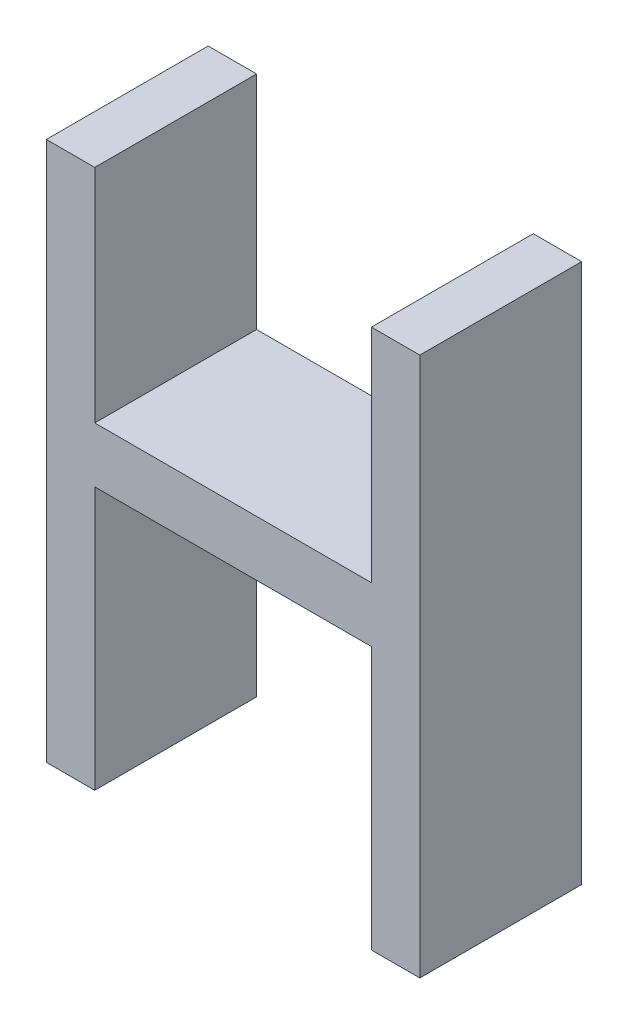
ISO-10303-21;
HEADER;
FILE_DESCRIPTION(('STEP AP214'),'2;1');
FILE_NAME('part.step','',(''),(''),'','','');
FILE_SCHEMA(('AUTOMOTIVE_DESIGN { 1 0 10303 214 1 1 1 1 }'));
ENDSEC;
DATA;
#1=APPLICATION_CONTEXT('core data for automotive mechanical design processes');
#2=APPLICATION_PROTOCOL_DEFINITION('international standard','automotive_design',2000,#1);
#3=PRODUCT_CONTEXT('',#1,'mechanical');
#4=PRODUCT('Part','Part','',(#3));
#5=PRODUCT_RELATED_PRODUCT_CATEGORY('part','',(#4));
#6=PRODUCT_DEFINITION_FORMATION('','',#4);
#7=PRODUCT_DEFINITION_CONTEXT('part definition',#1,'design');
#8=PRODUCT_DEFINITION('design','',#6,#7);
#9=PRODUCT_DEFINITION_SHAPE('','',#8);
#10=(LENGTH_UNIT() NAMED_UNIT(*) SI_UNIT(.MILLI.,.METRE.));
#11=(NAMED_UNIT(*) PLANE_ANGLE_UNIT() SI_UNIT($,.RADIAN.));
#12=(NAMED_UNIT(*) SI_UNIT($,.STERADIAN.) SOLID_ANGLE_UNIT());
#13=UNCERTAINTY_MEASURE_WITH_UNIT(LENGTH_MEASURE(1.E-05),#10,'distance_accuracy_value','');
#14=(GEOMETRIC_REPRESENTATION_CONTEXT(3) GLOBAL_UNCERTAINTY_ASSIGNED_CONTEXT((#13)) GLOBAL_UNIT_ASSIGNED_CONTEXT((#10,
#11,#12)) REPRESENTATION_CONTEXT('',''));
#15=CARTESIAN_POINT('',(0.,0.,0.));
#16=DIRECTION('',(0.,0.,1.));
#17=DIRECTION('',(1.,0.,0.));
#18=AXIS2_PLACEMENT_3D('',#15,#16,#17);
#19=CARTESIAN_POINT('',(-55.4324653258695,-22.8701190762308,1.5));
#20=DIRECTION('',(-1.,0.,0.));
#21=DIRECTION('',(0.,0.,1.));
#22=AXIS2_PLACEMENT_3D('',#19,#20,#21);
#23=PLANE('',#22);
#24=DIRECTION('',(0.,1.,0.));
#25=VECTOR('',#24,1.);
#26=CARTESIAN_POINT('',(-55.4324653258695,-22.8701190762308,0.));
#27=LINE('',#26,#25);
#28=CARTESIAN_POINT('',(-55.4324653258695,-22.8701190762308,0.));
#29=VERTEX_POINT('',#28);
#30=CARTESIAN_POINT('',(-55.4324653258695,-17.8701190762308,0.));
#31=VERTEX_POINT('',#30);
#32=EDGE_CURVE('E154',#29,#31,#27,.T.);
#33=ORIENTED_EDGE('',*,*,#32,.F.);
#34=DIRECTION('',(0.,0.,-1.));
#35=VECTOR('',#34,1.);
#36=CARTESIAN_POINT('',(-55.4324653258695,-22.8701190762308,1.5));
#37=LINE('',#36,#35);
#38=CARTESIAN_POINT('',(-55.4324653258695,-22.8701190762308,1.5));
#39=VERTEX_POINT('',#38);
#40=EDGE_CURVE('E11',#39,#29,#37,.T.);
#41=ORIENTED_EDGE('',*,*,#40,.F.);
#42=DIRECTION('',(0.,1.,0.));
#43=VECTOR('',#42,1.);
#44=CARTESIAN_POINT('',(-55.4324653258695,-22.8701190762308,1.5));
#45=LINE('',#44,#43);
#46=CARTESIAN_POINT('',(-55.4324653258695,-17.8701190762308,1.5));
#47=VERTEX_POINT('',#46);
#48=EDGE_CURVE('E186',#39,#47,#45,.T.);
#49=ORIENTED_EDGE('',*,*,#48,.T.);
#50=DIRECTION('',(0.,0.,-1.));
#51=VECTOR('',#50,1.);
#52=CARTESIAN_POINT('',(-55.4324653258695,-17.8701190762308,1.5));
#53=LINE('',#52,#51);
#54=EDGE_CURVE('E36',#47,#31,#53,.T.);
#55=ORIENTED_EDGE('',*,*,#54,.T.);
#56=EDGE_LOOP('',(#33,#41,#49,#55));
#57=FACE_BOUND('',#56,.T.);
#58=ADVANCED_FACE('F33',(#57),#23,.T.);
#59=CARTESIAN_POINT('',(-54.9837473771516,-22.8701190762308,1.5));
#60=DIRECTION('',(0.,-1.,0.));
#61=DIRECTION('',(0.,0.,-1.));
#62=AXIS2_PLACEMENT_3D('',#59,#60,#61);
#63=PLANE('',#62);
#64=DIRECTION('',(-1.,0.,0.));
#65=VECTOR('',#64,1.);
#66=CARTESIAN_POINT('',(-54.9837473771516,-22.8701190762308,0.));
#67=LINE('',#66,#65);
#68=CARTESIAN_POINT('',(-54.9837473771516,-22.8701190762308,0.));
#69=VERTEX_POINT('',#68);
#70=EDGE_CURVE('E184',#69,#29,#67,.T.);
#71=ORIENTED_EDGE('',*,*,#70,.F.);
#72=DIRECTION('',(0.,0.,-1.));
#73=VECTOR('',#72,1.);
#74=CARTESIAN_POINT('',(-54.9837473771516,-22.8701190762308,1.5));
#75=LINE('',#74,#73);
#76=CARTESIAN_POINT('',(-54.9837473771516,-22.8701190762308,1.5));
#77=VERTEX_POINT('',#76);
#78=EDGE_CURVE('E42',#77,#69,#75,.T.);
#79=ORIENTED_EDGE('',*,*,#78,.F.);
#80=DIRECTION('',(-1.,0.,0.));
#81=VECTOR('',#80,1.);
#82=CARTESIAN_POINT('',(-54.9837473771516,-22.8701190762308,1.5));
#83=LINE('',#82,#81);
#84=EDGE_CURVE('E144',#77,#39,#83,.T.);
#85=ORIENTED_EDGE('',*,*,#84,.T.);
#86=ORIENTED_EDGE('',*,*,#40,.T.);
#87=EDGE_LOOP('',(#71,#79,#85,#86));
#88=FACE_BOUND('',#87,.T.);
#89=ADVANCED_FACE('F206',(#88),#63,.T.);
#90=CARTESIAN_POINT('',(-54.9837473771516,-20.4342216403334,1.5));
#91=DIRECTION('',(1.,0.,0.));
#92=DIRECTION('',(0.,0.,-1.));
#93=AXIS2_PLACEMENT_3D('',#90,#91,#92);
#94=PLANE('',#93);
#95=DIRECTION('',(0.,-1.,0.));
#96=VECTOR('',#95,1.);
#97=CARTESIAN_POINT('',(-54.9837473771516,-20.4342216403334,0.));
#98=LINE('',#97,#96);
#99=CARTESIAN_POINT('',(-54.9837473771516,-20.4342216403334,0.));
#100=VERTEX_POINT('',#99);
#101=EDGE_CURVE('E131',#100,#69,#98,.T.);
#102=ORIENTED_EDGE('',*,*,#101,.F.);
#103=DIRECTION('',(0.,0.,-1.));
#104=VECTOR('',#103,1.);
#105=CARTESIAN_POINT('',(-54.9837473771516,-20.4342216403334,1.5));
#106=LINE('',#105,#104);
#107=CARTESIAN_POINT('',(-54.9837473771516,-20.4342216403334,1.5));
#108=VERTEX_POINT('',#107);
#109=EDGE_CURVE('E126',#108,#100,#106,.T.);
#110=ORIENTED_EDGE('',*,*,#109,.F.);
#111=DIRECTION('',(0.,-1.,0.));
#112=VECTOR('',#111,1.);
#113=CARTESIAN_POINT('',(-54.9837473771516,-20.4342216403334,1.5));
#114=LINE('',#113,#112);
#115=EDGE_CURVE('E129',#108,#77,#114,.T.);
#116=ORIENTED_EDGE('',*,*,#115,.T.);
#117=ORIENTED_EDGE('',*,*,#78,.T.);
#118=EDGE_LOOP('',(#102,#110,#116,#117));
#119=FACE_BOUND('',#118,.T.);
#120=ADVANCED_FACE('F128',(#119),#94,.T.);
#121=CARTESIAN_POINT('',(-52.419644813049,-20.4342216403334,1.5));
#122=DIRECTION('',(0.,-1.,0.));
#123=DIRECTION('',(0.,0.,-1.));
#124=AXIS2_PLACEMENT_3D('',#121,#122,#123);
#125=PLANE('',#124);
#126=DIRECTION('',(-1.,0.,0.));
#127=VECTOR('',#126,1.);
#128=CARTESIAN_POINT('',(-52.419644813049,-20.4342216403334,0.));
#129=LINE('',#128,#127);
#130=CARTESIAN_POINT('',(-52.419644813049,-20.4342216403334,0.));
#131=VERTEX_POINT('',#130);
#132=EDGE_CURVE('E181',#131,#100,#129,.T.);
#133=ORIENTED_EDGE('',*,*,#132,.F.);
#134=DIRECTION('',(0.,0.,-1.));
#135=VECTOR('',#134,1.);
#136=CARTESIAN_POINT('',(-52.419644813049,-20.4342216403334,1.5));
#137=LINE('',#136,#135);
#138=CARTESIAN_POINT('',(-52.419644813049,-20.4342216403334,1.5));
#139=VERTEX_POINT('',#138);
#140=EDGE_CURVE('E136',#139,#131,#137,.T.);
#141=ORIENTED_EDGE('',*,*,#140,.F.);
#142=DIRECTION('',(-1.,0.,0.));
#143=VECTOR('',#142,1.);
#144=CARTESIAN_POINT('',(-52.419644813049,-20.4342216403334,1.5));
#145=LINE('',#144,#143);
#146=EDGE_CURVE('E142',#139,#108,#145,.T.);
#147=ORIENTED_EDGE('',*,*,#146,.T.);
#148=ORIENTED_EDGE('',*,*,#109,.T.);
#149=EDGE_LOOP('',(#133,#141,#147,#148));
#150=FACE_BOUND('',#149,.T.);
#151=ADVANCED_FACE('F146',(#150),#125,.T.);
#152=CARTESIAN_POINT('',(-52.419644813049,-22.8701190762308,1.5));
#153=DIRECTION('',(-1.,0.,0.));
#154=DIRECTION('',(0.,0.,1.));
#155=AXIS2_PLACEMENT_3D('',#152,#153,#154);
#156=PLANE('',#155);
#157=DIRECTION('',(0.,1.,0.));
#158=VECTOR('',#157,1.);
#159=CARTESIAN_POINT('',(-52.419644813049,-22.8701190762308,0.));
#160=LINE('',#159,#158);
#161=CARTESIAN_POINT('',(-52.419644813049,-22.8701190762308,0.));
#162=VERTEX_POINT('',#161);
#163=EDGE_CURVE('E178',#162,#131,#160,.T.);
#164=ORIENTED_EDGE('',*,*,#163,.F.);
#165=DIRECTION('',(0.,0.,-1.));
#166=VECTOR('',#165,1.);
#167=CARTESIAN_POINT('',(-52.419644813049,-22.8701190762308,1.5));
#168=LINE('',#167,#166);
#169=CARTESIAN_POINT('',(-52.419644813049,-22.8701190762308,1.5));
#170=VERTEX_POINT('',#169);
#171=EDGE_CURVE('E190',#170,#162,#168,.T.);
#172=ORIENTED_EDGE('',*,*,#171,.F.);
#173=DIRECTION('',(0.,1.,0.));
#174=VECTOR('',#173,1.);
#175=CARTESIAN_POINT('',(-52.419644813049,-22.8701190762308,1.5));
#176=LINE('',#175,#174);
#177=EDGE_CURVE('E147',#170,#139,#176,.T.);
#178=ORIENTED_EDGE('',*,*,#177,.T.);
#179=ORIENTED_EDGE('',*,*,#140,.T.);
#180=EDGE_LOOP('',(#164,#172,#178,#179));
#181=FACE_BOUND('',#180,.T.);
#182=ADVANCED_FACE('F219',(#181),#156,.T.);
#183=CARTESIAN_POINT('',(-51.9709268643311,-22.8701190762308,1.5));
#184=DIRECTION('',(0.,-1.,0.));
#185=DIRECTION('',(0.,0.,-1.));
#186=AXIS2_PLACEMENT_3D('',#183,#184,#185);
#187=PLANE('',#186);
#188=DIRECTION('',(-1.,0.,0.));
#189=VECTOR('',#188,1.);
#190=CARTESIAN_POINT('',(-51.9709268643311,-22.8701190762308,0.));
#191=LINE('',#190,#189);
#192=CARTESIAN_POINT('',(-51.9709268643311,-22.8701190762308,0.));
#193=VERTEX_POINT('',#192);
#194=EDGE_CURVE('E175',#193,#162,#191,.T.);
#195=ORIENTED_EDGE('',*,*,#194,.F.);
#196=DIRECTION('',(0.,0.,-1.));
#197=VECTOR('',#196,1.);
#198=CARTESIAN_POINT('',(-51.9709268643311,-22.8701190762308,1.5));
#199=LINE('',#198,#197);
#200=CARTESIAN_POINT('',(-51.9709268643311,-22.8701190762308,1.5));
#201=VERTEX_POINT('',#200);
#202=EDGE_CURVE('E192',#201,#193,#199,.T.);
#203=ORIENTED_EDGE('',*,*,#202,.F.);
#204=DIRECTION('',(-1.,0.,0.));
#205=VECTOR('',#204,1.);
#206=CARTESIAN_POINT('',(-51.9709268643311,-22.8701190762308,1.5));
#207=LINE('',#206,#205);
#208=EDGE_CURVE('E149',#201,#170,#207,.T.);
#209=ORIENTED_EDGE('',*,*,#208,.T.);
#210=ORIENTED_EDGE('',*,*,#171,.T.);
#211=EDGE_LOOP('',(#195,#203,#209,#210));
#212=FACE_BOUND('',#211,.T.);
#213=ADVANCED_FACE('F222',(#212),#187,.T.);
#214=CARTESIAN_POINT('',(-51.9709268643311,-17.8701190762308,1.5));
#215=DIRECTION('',(1.,0.,0.));
#216=DIRECTION('',(0.,0.,-1.));
#217=AXIS2_PLACEMENT_3D('',#214,#215,#216);
#218=PLANE('',#217);
#219=DIRECTION('',(0.,-1.,0.));
#220=VECTOR('',#219,1.);
#221=CARTESIAN_POINT('',(-51.9709268643311,-17.8701190762308,0.));
#222=LINE('',#221,#220);
#223=CARTESIAN_POINT('',(-51.9709268643311,-17.8701190762308,0.));
#224=VERTEX_POINT('',#223);
#225=EDGE_CURVE('E172',#224,#193,#222,.T.);
#226=ORIENTED_EDGE('',*,*,#225,.F.);
#227=DIRECTION('',(0.,0.,-1.));
#228=VECTOR('',#227,1.);
#229=CARTESIAN_POINT('',(-51.9709268643311,-17.8701190762308,1.5));
#230=LINE('',#229,#228);
#231=CARTESIAN_POINT('',(-51.9709268643311,-17.8701190762308,1.5));
#232=VERTEX_POINT('',#231);
#233=EDGE_CURVE('E194',#232,#224,#230,.T.);
#234=ORIENTED_EDGE('',*,*,#233,.F.);
#235=DIRECTION('',(0.,-1.,0.));
#236=VECTOR('',#235,1.);
#237=CARTESIAN_POINT('',(-51.9709268643311,-17.8701190762308,1.5));
#238=LINE('',#237,#236);
#239=EDGE_CURVE('E366',#232,#201,#238,.T.);
#240=ORIENTED_EDGE('',*,*,#239,.T.);
#241=ORIENTED_EDGE('',*,*,#202,.T.);
#242=EDGE_LOOP('',(#226,#234,#240,#241));
#243=FACE_BOUND('',#242,.T.);
#244=ADVANCED_FACE('F226',(#243),#218,.T.);
#245=CARTESIAN_POINT('',(-52.419644813049,-17.8701190762308,1.5));
#246=DIRECTION('',(0.,1.,0.));
#247=DIRECTION('',(0.,0.,1.));
#248=AXIS2_PLACEMENT_3D('',#245,#246,#247);
#249=PLANE('',#248);
#250=DIRECTION('',(1.,0.,0.));
#251=VECTOR('',#250,1.);
#252=CARTESIAN_POINT('',(-52.419644813049,-17.8701190762308,0.));
#253=LINE('',#252,#251);
#254=CARTESIAN_POINT('',(-52.419644813049,-17.8701190762308,0.));
#255=VERTEX_POINT('',#254);
#256=EDGE_CURVE('E169',#255,#224,#253,.T.);
#257=ORIENTED_EDGE('',*,*,#256,.F.);
#258=DIRECTION('',(0.,0.,-1.));
#259=VECTOR('',#258,1.);
#260=CARTESIAN_POINT('',(-52.419644813049,-17.8701190762308,1.5));
#261=LINE('',#260,#259);
#262=CARTESIAN_POINT('',(-52.419644813049,-17.8701190762308,1.5));
#263=VERTEX_POINT('',#262);
#264=EDGE_CURVE('E196',#263,#255,#261,.T.);
#265=ORIENTED_EDGE('',*,*,#264,.F.);
#266=DIRECTION('',(1.,0.,0.));
#267=VECTOR('',#266,1.);
#268=CARTESIAN_POINT('',(-52.419644813049,-17.8701190762308,1.5));
#269=LINE('',#268,#267);
#270=EDGE_CURVE('E370',#263,#232,#269,.T.);
#271=ORIENTED_EDGE('',*,*,#270,.T.);
#272=ORIENTED_EDGE('',*,*,#233,.T.);
#273=EDGE_LOOP('',(#257,#265,#271,#272));
#274=FACE_BOUND('',#273,.T.);
#275=ADVANCED_FACE('F230',(#274),#249,.T.);
#276=CARTESIAN_POINT('',(-52.419644813049,-19.9214011275129,1.5));
#277=DIRECTION('',(-1.,0.,0.));
#278=DIRECTION('',(0.,0.,1.));
#279=AXIS2_PLACEMENT_3D('',#276,#277,#278);
#280=PLANE('',#279);
#281=DIRECTION('',(0.,1.,0.));
#282=VECTOR('',#281,1.);
#283=CARTESIAN_POINT('',(-52.419644813049,-19.9214011275129,0.));
#284=LINE('',#283,#282);
#285=CARTESIAN_POINT('',(-52.419644813049,-19.9214011275129,0.));
#286=VERTEX_POINT('',#285);
#287=EDGE_CURVE('E166',#286,#255,#284,.T.);
#288=ORIENTED_EDGE('',*,*,#287,.F.);
#289=DIRECTION('',(0.,0.,-1.));
#290=VECTOR('',#289,1.);
#291=CARTESIAN_POINT('',(-52.419644813049,-19.9214011275129,1.5));
#292=LINE('',#291,#290);
#293=CARTESIAN_POINT('',(-52.419644813049,-19.9214011275129,1.5));
#294=VERTEX_POINT('',#293);
#295=EDGE_CURVE('E198',#294,#286,#292,.T.);
#296=ORIENTED_EDGE('',*,*,#295,.F.);
#297=DIRECTION('',(0.,1.,0.));
#298=VECTOR('',#297,1.);
#299=CARTESIAN_POINT('',(-52.419644813049,-19.9214011275129,1.5));
#300=LINE('',#299,#298);
#301=EDGE_CURVE('E359',#294,#263,#300,.T.);
#302=ORIENTED_EDGE('',*,*,#301,.T.);
#303=ORIENTED_EDGE('',*,*,#264,.T.);
#304=EDGE_LOOP('',(#288,#296,#302,#303));
#305=FACE_BOUND('',#304,.T.);
#306=ADVANCED_FACE('F234',(#305),#280,.T.);
#307=CARTESIAN_POINT('',(-54.9837473771516,-19.9214011275129,1.5));
#308=DIRECTION('',(0.,1.,0.));
#309=DIRECTION('',(0.,0.,1.));
#310=AXIS2_PLACEMENT_3D('',#307,#308,#309);
#311=PLANE('',#310);
#312=DIRECTION('',(1.,0.,0.));
#313=VECTOR('',#312,1.);
#314=CARTESIAN_POINT('',(-54.9837473771516,-19.9214011275129,0.));
#315=LINE('',#314,#313);
#316=CARTESIAN_POINT('',(-54.9837473771516,-19.9214011275129,0.));
#317=VERTEX_POINT('',#316);
#318=EDGE_CURVE('E163',#317,#286,#315,.T.);
#319=ORIENTED_EDGE('',*,*,#318,.F.);
#320=DIRECTION('',(0.,0.,-1.));
#321=VECTOR('',#320,1.);
#322=CARTESIAN_POINT('',(-54.9837473771516,-19.9214011275129,1.5));
#323=LINE('',#322,#321);
#324=CARTESIAN_POINT('',(-54.9837473771516,-19.9214011275129,1.5));
#325=VERTEX_POINT('',#324);
#326=EDGE_CURVE('E200',#325,#317,#323,.T.);
#327=ORIENTED_EDGE('',*,*,#326,.F.);
#328=DIRECTION('',(1.,0.,0.));
#329=VECTOR('',#328,1.);
#330=CARTESIAN_POINT('',(-54.9837473771516,-19.9214011275129,1.5));
#331=LINE('',#330,#329);
#332=EDGE_CURVE('E355',#325,#294,#331,.T.);
#333=ORIENTED_EDGE('',*,*,#332,.T.);
#334=ORIENTED_EDGE('',*,*,#295,.T.);
#335=EDGE_LOOP('',(#319,#327,#333,#334));
#336=FACE_BOUND('',#335,.T.);
#337=ADVANCED_FACE('F238',(#336),#311,.T.);
#338=CARTESIAN_POINT('',(-54.9837473771516,-17.8701190762308,1.5));
#339=DIRECTION('',(1.,0.,0.));
#340=DIRECTION('',(0.,0.,-1.));
#341=AXIS2_PLACEMENT_3D('',#338,#339,#340);
#342=PLANE('',#341);
#343=DIRECTION('',(0.,-1.,0.));
#344=VECTOR('',#343,1.);
#345=CARTESIAN_POINT('',(-54.9837473771516,-17.8701190762308,0.));
#346=LINE('',#345,#344);
#347=CARTESIAN_POINT('',(-54.9837473771516,-17.8701190762308,0.));
#348=VERTEX_POINT('',#347);
#349=EDGE_CURVE('E160',#348,#317,#346,.T.);
#350=ORIENTED_EDGE('',*,*,#349,.F.);
#351=DIRECTION('',(0.,0.,-1.));
#352=VECTOR('',#351,1.);
#353=CARTESIAN_POINT('',(-54.9837473771516,-17.8701190762308,1.5));
#354=LINE('',#353,#352);
#355=CARTESIAN_POINT('',(-54.9837473771516,-17.8701190762308,1.5));
#356=VERTEX_POINT('',#355);
#357=EDGE_CURVE('E201',#356,#348,#354,.T.);
#358=ORIENTED_EDGE('',*,*,#357,.F.);
#359=DIRECTION('',(0.,-1.,0.));
#360=VECTOR('',#359,1.);
#361=CARTESIAN_POINT('',(-54.9837473771516,-17.8701190762308,1.5));
#362=LINE('',#361,#360);
#363=EDGE_CURVE('E376',#356,#325,#362,.T.);
#364=ORIENTED_EDGE('',*,*,#363,.T.);
#365=ORIENTED_EDGE('',*,*,#326,.T.);
#366=EDGE_LOOP('',(#350,#358,#364,#365));
#367=FACE_BOUND('',#366,.T.);
#368=ADVANCED_FACE('F242',(#367),#342,.T.);
#369=CARTESIAN_POINT('',(-55.4324653258695,-17.8701190762308,1.5));
#370=DIRECTION('',(0.,1.,0.));
#371=DIRECTION('',(0.,0.,1.));
#372=AXIS2_PLACEMENT_3D('',#369,#370,#371);
#373=PLANE('',#372);
#374=DIRECTION('',(1.,0.,0.));
#375=VECTOR('',#374,1.);
#376=CARTESIAN_POINT('',(-55.4324653258695,-17.8701190762308,0.));
#377=LINE('',#376,#375);
#378=EDGE_CURVE('E157',#31,#348,#377,.T.);
#379=ORIENTED_EDGE('',*,*,#378,.F.);
#380=ORIENTED_EDGE('',*,*,#54,.F.);
#381=DIRECTION('',(1.,0.,0.));
#382=VECTOR('',#381,1.);
#383=CARTESIAN_POINT('',(-55.4324653258695,-17.8701190762308,1.5));
#384=LINE('',#383,#382);
#385=EDGE_CURVE('E378',#47,#356,#384,.T.);
#386=ORIENTED_EDGE('',*,*,#385,.T.);
#387=ORIENTED_EDGE('',*,*,#357,.T.);
#388=EDGE_LOOP('',(#379,#380,#386,#387));
#389=FACE_BOUND('',#388,.T.);
#390=ADVANCED_FACE('F203',(#389),#373,.T.);
#391=CARTESIAN_POINT('',(0.,0.,1.5));
#392=DIRECTION('',(0.,0.,-1.));
#393=DIRECTION('',(-1.,0.,0.));
#394=AXIS2_PLACEMENT_3D('',#391,#392,#393);
#395=PLANE('',#394);
#396=ORIENTED_EDGE('',*,*,#48,.F.);
#397=ORIENTED_EDGE('',*,*,#84,.F.);
#398=ORIENTED_EDGE('',*,*,#115,.F.);
#399=ORIENTED_EDGE('',*,*,#146,.F.);
#400=ORIENTED_EDGE('',*,*,#177,.F.);
#401=ORIENTED_EDGE('',*,*,#208,.F.);
#402=ORIENTED_EDGE('',*,*,#239,.F.);
#403=ORIENTED_EDGE('',*,*,#270,.F.);
#404=ORIENTED_EDGE('',*,*,#301,.F.);
#405=ORIENTED_EDGE('',*,*,#332,.F.);
#406=ORIENTED_EDGE('',*,*,#363,.F.);
#407=ORIENTED_EDGE('',*,*,#385,.F.);
#408=EDGE_LOOP('',(#396,#397,#398,#399,#400,#401,#402,#403,#404,#405,#406,#407));
#409=FACE_BOUND('',#408,.T.);
#410=ADVANCED_FACE('F140',(#409),#395,.F.);
#411=CARTESIAN_POINT('',(0.,0.,0.));
#412=DIRECTION('',(0.,0.,-1.));
#413=DIRECTION('',(-1.,0.,0.));
#414=AXIS2_PLACEMENT_3D('',#411,#412,#413);
#415=PLANE('',#414);
#416=ORIENTED_EDGE('',*,*,#32,.T.);
#417=ORIENTED_EDGE('',*,*,#378,.T.);
#418=ORIENTED_EDGE('',*,*,#349,.T.);
#419=ORIENTED_EDGE('',*,*,#318,.T.);
#420=ORIENTED_EDGE('',*,*,#287,.T.);
#421=ORIENTED_EDGE('',*,*,#256,.T.);
#422=ORIENTED_EDGE('',*,*,#225,.T.);
#423=ORIENTED_EDGE('',*,*,#194,.T.);
#424=ORIENTED_EDGE('',*,*,#163,.T.);
#425=ORIENTED_EDGE('',*,*,#132,.T.);
#426=ORIENTED_EDGE('',*,*,#101,.T.);
#427=ORIENTED_EDGE('',*,*,#70,.T.);
#428=EDGE_LOOP('',(#416,#417,#418,#419,#420,#421,#422,#423,#424,#425,#426,#427));
#429=FACE_BOUND('',#428,.T.);
#430=ADVANCED_FACE('F205',(#429),#415,.T.);
#431=CLOSED_SHELL('',(#58,#89,#120,#151,#182,#213,#244,#275,#306,#337,#368,#390,#410,#430));
#432=MANIFOLD_SOLID_BREP('B2',#431);
#433=ADVANCED_BREP_SHAPE_REPRESENTATION('',(#18,#432),#14);
#434=SHAPE_DEFINITION_REPRESENTATION(#9,#433);
ENDSEC;
END-ISO-10303-21;
